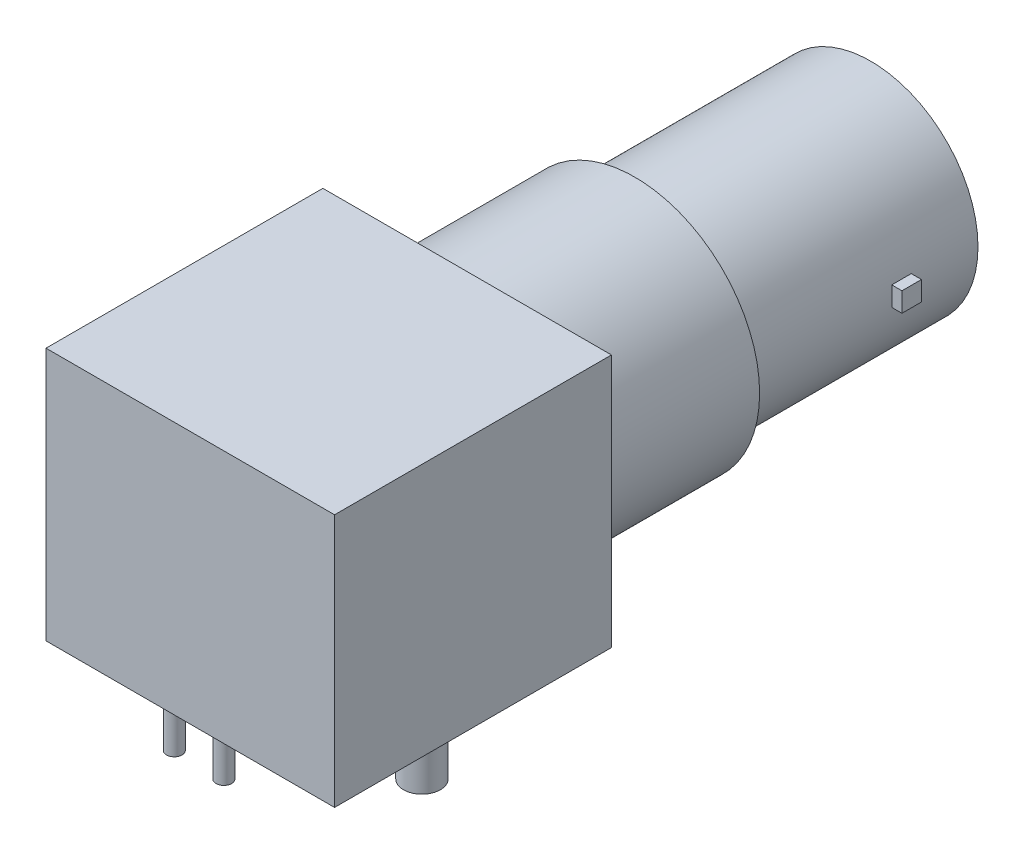
ISO-10303-21;
HEADER;
FILE_DESCRIPTION(('STEP AP214'),'2;1');
FILE_NAME('part.step','',(''),(''),'','','');
FILE_SCHEMA(('AUTOMOTIVE_DESIGN { 1 0 10303 214 1 1 1 1 }'));
ENDSEC;
DATA;
#1=APPLICATION_CONTEXT('core data for automotive mechanical design processes');
#2=APPLICATION_PROTOCOL_DEFINITION('international standard','automotive_design',2000,#1);
#3=PRODUCT_CONTEXT('',#1,'mechanical');
#4=PRODUCT('Part','Part','',(#3));
#5=PRODUCT_RELATED_PRODUCT_CATEGORY('part','',(#4));
#6=PRODUCT_DEFINITION_FORMATION('','',#4);
#7=PRODUCT_DEFINITION_CONTEXT('part definition',#1,'design');
#8=PRODUCT_DEFINITION('design','',#6,#7);
#9=PRODUCT_DEFINITION_SHAPE('','',#8);
#10=(LENGTH_UNIT() NAMED_UNIT(*) SI_UNIT(.MILLI.,.METRE.));
#11=(NAMED_UNIT(*) PLANE_ANGLE_UNIT() SI_UNIT($,.RADIAN.));
#12=(NAMED_UNIT(*) SI_UNIT($,.STERADIAN.) SOLID_ANGLE_UNIT());
#13=UNCERTAINTY_MEASURE_WITH_UNIT(LENGTH_MEASURE(1.E-05),#10,'distance_accuracy_value','');
#14=(GEOMETRIC_REPRESENTATION_CONTEXT(3) GLOBAL_UNCERTAINTY_ASSIGNED_CONTEXT((#13)) GLOBAL_UNIT_ASSIGNED_CONTEXT((#10,
#11,#12)) REPRESENTATION_CONTEXT('',''));
#15=CARTESIAN_POINT('',(0.,0.,0.));
#16=DIRECTION('',(0.,0.,1.));
#17=DIRECTION('',(1.,0.,0.));
#18=AXIS2_PLACEMENT_3D('',#15,#16,#17);
#19=CARTESIAN_POINT('',(-7.40000000000001,-6.5,-14.2));
#20=DIRECTION('',(0.,-1.,0.));
#21=DIRECTION('',(0.,0.,-1.));
#22=AXIS2_PLACEMENT_3D('',#19,#20,#21);
#23=PLANE('',#22);
#24=CARTESIAN_POINT('',(0.,-6.5,-1.72));
#25=DIRECTION('',(0.,-1.,0.));
#26=DIRECTION('',(0.,0.,-1.));
#27=AXIS2_PLACEMENT_3D('',#24,#25,#26);
#28=CIRCLE('',#27,0.4);
#29=CARTESIAN_POINT('',(0.,-6.5,-2.12));
#30=VERTEX_POINT('',#29);
#31=EDGE_CURVE('E384',#30,#30,#28,.T.);
#32=ORIENTED_EDGE('',*,*,#31,.F.);
#33=EDGE_LOOP('',(#32));
#34=FACE_BOUND('',#33,.T.);
#35=CARTESIAN_POINT('',(5.08,-6.5,-6.8));
#36=DIRECTION('',(0.,-1.,0.));
#37=DIRECTION('',(0.,0.,-1.));
#38=AXIS2_PLACEMENT_3D('',#35,#36,#37);
#39=CIRCLE('',#38,0.949999999999999);
#40=CARTESIAN_POINT('',(5.08,-6.5,-7.75));
#41=VERTEX_POINT('',#40);
#42=EDGE_CURVE('E179',#41,#41,#39,.T.);
#43=ORIENTED_EDGE('',*,*,#42,.F.);
#44=EDGE_LOOP('',(#43));
#45=FACE_BOUND('',#44,.T.);
#46=DIRECTION('',(1.,0.,0.));
#47=VECTOR('',#46,1.);
#48=CARTESIAN_POINT('',(-7.40000000000001,-6.5,0.));
#49=LINE('',#48,#47);
#50=CARTESIAN_POINT('',(-7.40000000000001,-6.5,0.));
#51=VERTEX_POINT('',#50);
#52=CARTESIAN_POINT('',(7.4,-6.5,0.));
#53=VERTEX_POINT('',#52);
#54=EDGE_CURVE('E243',#51,#53,#49,.T.);
#55=ORIENTED_EDGE('',*,*,#54,.F.);
#56=DIRECTION('',(0.,0.,1.));
#57=VECTOR('',#56,1.);
#58=CARTESIAN_POINT('',(-7.40000000000001,-6.5,-14.2));
#59=LINE('',#58,#57);
#60=CARTESIAN_POINT('',(-7.40000000000001,-6.5,-14.2));
#61=VERTEX_POINT('',#60);
#62=EDGE_CURVE('E266',#61,#51,#59,.T.);
#63=ORIENTED_EDGE('',*,*,#62,.F.);
#64=DIRECTION('',(1.,0.,0.));
#65=VECTOR('',#64,1.);
#66=CARTESIAN_POINT('',(-7.40000000000001,-6.5,-14.2));
#67=LINE('',#66,#65);
#68=CARTESIAN_POINT('',(7.4,-6.5,-14.2));
#69=VERTEX_POINT('',#68);
#70=EDGE_CURVE('E249',#61,#69,#67,.T.);
#71=ORIENTED_EDGE('',*,*,#70,.T.);
#72=DIRECTION('',(0.,0.,1.));
#73=VECTOR('',#72,1.);
#74=CARTESIAN_POINT('',(7.4,-6.5,-14.2));
#75=LINE('',#74,#73);
#76=EDGE_CURVE('E263',#69,#53,#75,.T.);
#77=ORIENTED_EDGE('',*,*,#76,.T.);
#78=EDGE_LOOP('',(#55,#63,#71,#77));
#79=FACE_BOUND('',#78,.T.);
#80=CARTESIAN_POINT('',(-5.08,-6.5,-6.8));
#81=DIRECTION('',(0.,-1.,0.));
#82=DIRECTION('',(0.,0.,-1.));
#83=AXIS2_PLACEMENT_3D('',#80,#81,#82);
#84=CIRCLE('',#83,0.95);
#85=CARTESIAN_POINT('',(-5.08,-6.5,-7.75));
#86=VERTEX_POINT('',#85);
#87=EDGE_CURVE('E376',#86,#86,#84,.T.);
#88=ORIENTED_EDGE('',*,*,#87,.F.);
#89=EDGE_LOOP('',(#88));
#90=FACE_BOUND('',#89,.T.);
#91=CARTESIAN_POINT('',(-2.54,-6.5,-1.72));
#92=DIRECTION('',(0.,-1.,0.));
#93=DIRECTION('',(0.,0.,-1.));
#94=AXIS2_PLACEMENT_3D('',#91,#92,#93);
#95=CIRCLE('',#94,0.4);
#96=CARTESIAN_POINT('',(-2.54,-6.5,-2.12));
#97=VERTEX_POINT('',#96);
#98=EDGE_CURVE('E379',#97,#97,#95,.T.);
#99=ORIENTED_EDGE('',*,*,#98,.F.);
#100=EDGE_LOOP('',(#99));
#101=FACE_BOUND('',#100,.T.);
#102=ADVANCED_FACE('F37',(#34,#45,#79,#90,#101),#23,.T.);
#103=CARTESIAN_POINT('',(0.,0.,-22.8));
#104=DIRECTION('',(0.,0.,-1.));
#105=DIRECTION('',(-1.,0.,0.));
#106=AXIS2_PLACEMENT_3D('',#103,#104,#105);
#107=PLANE('',#106);
#108=CARTESIAN_POINT('',(0.,0.,-22.8));
#109=DIRECTION('',(0.,0.,-1.));
#110=DIRECTION('',(-1.,0.,0.));
#111=AXIS2_PLACEMENT_3D('',#108,#109,#110);
#112=CIRCLE('',#111,6.4);
#113=CARTESIAN_POINT('',(6.4,0.,-22.8));
#114=VERTEX_POINT('',#113);
#115=EDGE_CURVE('E233',#114,#114,#112,.T.);
#116=ORIENTED_EDGE('',*,*,#115,.T.);
#117=EDGE_LOOP('',(#116));
#118=FACE_BOUND('',#117,.T.);
#119=CARTESIAN_POINT('',(0.,0.,-22.8));
#120=DIRECTION('',(0.,0.,-1.));
#121=DIRECTION('',(-1.,0.,0.));
#122=AXIS2_PLACEMENT_3D('',#119,#120,#121);
#123=CIRCLE('',#122,5.5);
#124=CARTESIAN_POINT('',(-5.5,0.,-22.8));
#125=VERTEX_POINT('',#124);
#126=EDGE_CURVE('E229',#125,#125,#123,.T.);
#127=ORIENTED_EDGE('',*,*,#126,.F.);
#128=EDGE_LOOP('',(#127));
#129=FACE_BOUND('',#128,.T.);
#130=ADVANCED_FACE('F327',(#118,#129),#107,.T.);
#131=CARTESIAN_POINT('',(0.,0.,-14.2));
#132=DIRECTION('',(0.,0.,1.));
#133=DIRECTION('',(1.,0.,0.));
#134=AXIS2_PLACEMENT_3D('',#131,#132,#133);
#135=PLANE('',#134);
#136=DIRECTION('',(0.,1.,0.));
#137=VECTOR('',#136,1.);
#138=CARTESIAN_POINT('',(7.39999999999999,6.5,-14.2));
#139=LINE('',#138,#137);
#140=CARTESIAN_POINT('',(7.39999999999999,6.5,-14.2));
#141=VERTEX_POINT('',#140);
#142=EDGE_CURVE('E239',#69,#141,#139,.T.);
#143=ORIENTED_EDGE('',*,*,#142,.F.);
#144=ORIENTED_EDGE('',*,*,#70,.F.);
#145=DIRECTION('',(0.,-1.,0.));
#146=VECTOR('',#145,1.);
#147=CARTESIAN_POINT('',(-7.40000000000001,6.5,-14.2));
#148=LINE('',#147,#146);
#149=CARTESIAN_POINT('',(-7.40000000000001,6.5,-14.2));
#150=VERTEX_POINT('',#149);
#151=EDGE_CURVE('E246',#150,#61,#148,.T.);
#152=ORIENTED_EDGE('',*,*,#151,.F.);
#153=DIRECTION('',(-1.,0.,0.));
#154=VECTOR('',#153,1.);
#155=CARTESIAN_POINT('',(-7.40000000000001,6.5,-14.2));
#156=LINE('',#155,#154);
#157=EDGE_CURVE('E242',#141,#150,#156,.T.);
#158=ORIENTED_EDGE('',*,*,#157,.F.);
#159=EDGE_LOOP('',(#143,#144,#152,#158));
#160=FACE_BOUND('',#159,.T.);
#161=CARTESIAN_POINT('',(0.,0.,-14.2));
#162=DIRECTION('',(0.,0.,1.));
#163=DIRECTION('',(1.,0.,0.));
#164=AXIS2_PLACEMENT_3D('',#161,#162,#163);
#165=CIRCLE('',#164,6.4);
#166=CARTESIAN_POINT('',(6.4,0.,-14.2));
#167=VERTEX_POINT('',#166);
#168=EDGE_CURVE('E265',#167,#167,#165,.F.);
#169=ORIENTED_EDGE('',*,*,#168,.F.);
#170=EDGE_LOOP('',(#169));
#171=FACE_BOUND('',#170,.T.);
#172=ADVANCED_FACE('F336',(#160,#171),#135,.F.);
#173=CARTESIAN_POINT('',(7.39999999999999,6.5,-14.2));
#174=DIRECTION('',(1.,0.,0.));
#175=DIRECTION('',(0.,1.,0.));
#176=AXIS2_PLACEMENT_3D('',#173,#174,#175);
#177=PLANE('',#176);
#178=DIRECTION('',(0.,1.,0.));
#179=VECTOR('',#178,1.);
#180=CARTESIAN_POINT('',(7.39999999999999,6.5,0.));
#181=LINE('',#180,#179);
#182=CARTESIAN_POINT('',(7.39999999999999,6.5,0.));
#183=VERTEX_POINT('',#182);
#184=EDGE_CURVE('E238',#53,#183,#181,.T.);
#185=ORIENTED_EDGE('',*,*,#184,.F.);
#186=ORIENTED_EDGE('',*,*,#76,.F.);
#187=ORIENTED_EDGE('',*,*,#142,.T.);
#188=DIRECTION('',(0.,0.,1.));
#189=VECTOR('',#188,1.);
#190=CARTESIAN_POINT('',(7.39999999999999,6.5,-14.2));
#191=LINE('',#190,#189);
#192=EDGE_CURVE('E252',#141,#183,#191,.T.);
#193=ORIENTED_EDGE('',*,*,#192,.T.);
#194=EDGE_LOOP('',(#185,#186,#187,#193));
#195=FACE_BOUND('',#194,.T.);
#196=ADVANCED_FACE('F39',(#195),#177,.T.);
#197=CARTESIAN_POINT('',(-7.40000000000001,6.5,-14.2));
#198=DIRECTION('',(-1.,0.,0.));
#199=DIRECTION('',(0.,-1.,0.));
#200=AXIS2_PLACEMENT_3D('',#197,#198,#199);
#201=PLANE('',#200);
#202=DIRECTION('',(0.,-1.,0.));
#203=VECTOR('',#202,1.);
#204=CARTESIAN_POINT('',(-7.40000000000001,6.5,0.));
#205=LINE('',#204,#203);
#206=CARTESIAN_POINT('',(-7.40000000000001,6.5,0.));
#207=VERTEX_POINT('',#206);
#208=EDGE_CURVE('E258',#207,#51,#205,.T.);
#209=ORIENTED_EDGE('',*,*,#208,.F.);
#210=DIRECTION('',(0.,0.,1.));
#211=VECTOR('',#210,1.);
#212=CARTESIAN_POINT('',(-7.40000000000001,6.5,-14.2));
#213=LINE('',#212,#211);
#214=EDGE_CURVE('E268',#150,#207,#213,.T.);
#215=ORIENTED_EDGE('',*,*,#214,.F.);
#216=ORIENTED_EDGE('',*,*,#151,.T.);
#217=ORIENTED_EDGE('',*,*,#62,.T.);
#218=EDGE_LOOP('',(#209,#215,#216,#217));
#219=FACE_BOUND('',#218,.T.);
#220=ADVANCED_FACE('F349',(#219),#201,.T.);
#221=CARTESIAN_POINT('',(-7.40000000000001,6.5,-14.2));
#222=DIRECTION('',(0.,1.,0.));
#223=DIRECTION('',(0.,0.,1.));
#224=AXIS2_PLACEMENT_3D('',#221,#222,#223);
#225=PLANE('',#224);
#226=DIRECTION('',(-1.,0.,0.));
#227=VECTOR('',#226,1.);
#228=CARTESIAN_POINT('',(-7.40000000000001,6.5,0.));
#229=LINE('',#228,#227);
#230=EDGE_CURVE('E255',#183,#207,#229,.T.);
#231=ORIENTED_EDGE('',*,*,#230,.F.);
#232=ORIENTED_EDGE('',*,*,#192,.F.);
#233=ORIENTED_EDGE('',*,*,#157,.T.);
#234=ORIENTED_EDGE('',*,*,#214,.T.);
#235=EDGE_LOOP('',(#231,#232,#233,#234));
#236=FACE_BOUND('',#235,.T.);
#237=ADVANCED_FACE('F351',(#236),#225,.T.);
#238=CARTESIAN_POINT('',(0.,0.,0.));
#239=DIRECTION('',(0.,0.,1.));
#240=DIRECTION('',(1.,0.,0.));
#241=AXIS2_PLACEMENT_3D('',#238,#239,#240);
#242=PLANE('',#241);
#243=ORIENTED_EDGE('',*,*,#184,.T.);
#244=ORIENTED_EDGE('',*,*,#230,.T.);
#245=ORIENTED_EDGE('',*,*,#208,.T.);
#246=ORIENTED_EDGE('',*,*,#54,.T.);
#247=EDGE_LOOP('',(#243,#244,#245,#246));
#248=FACE_BOUND('',#247,.T.);
#249=ADVANCED_FACE('F347',(#248),#242,.T.);
#250=CARTESIAN_POINT('',(0.,0.,-22.8));
#251=DIRECTION('',(0.,0.,1.));
#252=DIRECTION('',(1.,0.,0.));
#253=AXIS2_PLACEMENT_3D('',#250,#251,#252);
#254=CYLINDRICAL_SURFACE('',#253,6.4);
#255=CARTESIAN_POINT('',(6.4,0.,-22.8));
#256=CARTESIAN_POINT('',(6.4,0.,-22.7104166666667));
#257=CARTESIAN_POINT('',(6.4,0.,-22.6208333333333));
#258=CARTESIAN_POINT('',(6.4,0.,-22.4416666666667));
#259=CARTESIAN_POINT('',(6.4,0.,-22.3520833333333));
#260=CARTESIAN_POINT('',(6.4,0.,-22.1729166666667));
#261=CARTESIAN_POINT('',(6.4,0.,-22.0833333333333));
#262=CARTESIAN_POINT('',(6.4,0.,-21.9041666666667));
#263=CARTESIAN_POINT('',(6.4,0.,-21.8145833333333));
#264=CARTESIAN_POINT('',(6.4,0.,-21.6354166666667));
#265=CARTESIAN_POINT('',(6.4,0.,-21.5458333333333));
#266=CARTESIAN_POINT('',(6.4,0.,-21.3666666666667));
#267=CARTESIAN_POINT('',(6.4,0.,-21.2770833333333));
#268=CARTESIAN_POINT('',(6.4,0.,-21.0979166666667));
#269=CARTESIAN_POINT('',(6.4,0.,-21.0083333333333));
#270=CARTESIAN_POINT('',(6.4,0.,-20.8291666666667));
#271=CARTESIAN_POINT('',(6.4,0.,-20.7395833333333));
#272=CARTESIAN_POINT('',(6.4,0.,-20.5604166666667));
#273=CARTESIAN_POINT('',(6.4,0.,-20.4708333333333));
#274=CARTESIAN_POINT('',(6.4,0.,-20.2916666666667));
#275=CARTESIAN_POINT('',(6.4,0.,-20.2020833333333));
#276=CARTESIAN_POINT('',(6.4,0.,-20.0229166666667));
#277=CARTESIAN_POINT('',(6.4,0.,-19.9333333333333));
#278=CARTESIAN_POINT('',(6.4,0.,-19.7541666666667));
#279=CARTESIAN_POINT('',(6.4,0.,-19.6645833333333));
#280=CARTESIAN_POINT('',(6.4,0.,-19.4854166666667));
#281=CARTESIAN_POINT('',(6.4,0.,-19.3958333333333));
#282=CARTESIAN_POINT('',(6.4,0.,-19.2166666666667));
#283=CARTESIAN_POINT('',(6.4,0.,-19.1270833333333));
#284=CARTESIAN_POINT('',(6.4,0.,-18.9479166666667));
#285=CARTESIAN_POINT('',(6.4,0.,-18.8583333333333));
#286=CARTESIAN_POINT('',(6.4,0.,-18.6791666666667));
#287=CARTESIAN_POINT('',(6.4,0.,-18.5895833333333));
#288=CARTESIAN_POINT('',(6.4,0.,-18.4104166666667));
#289=CARTESIAN_POINT('',(6.4,0.,-18.3208333333333));
#290=CARTESIAN_POINT('',(6.4,0.,-18.1416666666667));
#291=CARTESIAN_POINT('',(6.4,0.,-18.0520833333333));
#292=CARTESIAN_POINT('',(6.4,0.,-17.8729166666667));
#293=CARTESIAN_POINT('',(6.4,0.,-17.7833333333333));
#294=CARTESIAN_POINT('',(6.4,0.,-17.6041666666667));
#295=CARTESIAN_POINT('',(6.4,0.,-17.5145833333333));
#296=CARTESIAN_POINT('',(6.4,0.,-17.3354166666667));
#297=CARTESIAN_POINT('',(6.4,0.,-17.2458333333333));
#298=CARTESIAN_POINT('',(6.4,0.,-17.0666666666667));
#299=CARTESIAN_POINT('',(6.4,0.,-16.9770833333333));
#300=CARTESIAN_POINT('',(6.4,0.,-16.7979166666667));
#301=CARTESIAN_POINT('',(6.4,0.,-16.7083333333333));
#302=CARTESIAN_POINT('',(6.4,0.,-16.5291666666667));
#303=CARTESIAN_POINT('',(6.4,0.,-16.4395833333333));
#304=CARTESIAN_POINT('',(6.4,0.,-16.2604166666667));
#305=CARTESIAN_POINT('',(6.4,0.,-16.1708333333333));
#306=CARTESIAN_POINT('',(6.4,0.,-15.9916666666667));
#307=CARTESIAN_POINT('',(6.4,0.,-15.9020833333333));
#308=CARTESIAN_POINT('',(6.4,0.,-15.7229166666667));
#309=CARTESIAN_POINT('',(6.4,0.,-15.6333333333333));
#310=CARTESIAN_POINT('',(6.4,0.,-15.4541666666667));
#311=CARTESIAN_POINT('',(6.4,0.,-15.3645833333333));
#312=CARTESIAN_POINT('',(6.4,0.,-15.1854166666667));
#313=CARTESIAN_POINT('',(6.4,0.,-15.0958333333333));
#314=CARTESIAN_POINT('',(6.4,0.,-14.9166666666667));
#315=CARTESIAN_POINT('',(6.4,0.,-14.8270833333333));
#316=CARTESIAN_POINT('',(6.4,0.,-14.6479166666667));
#317=CARTESIAN_POINT('',(6.4,0.,-14.5583333333333));
#318=CARTESIAN_POINT('',(6.4,0.,-14.3791666666667));
#319=CARTESIAN_POINT('',(6.4,0.,-14.2895833333333));
#320=CARTESIAN_POINT('',(6.4,0.,-14.2));
#321=B_SPLINE_CURVE_WITH_KNOTS('',3,(#255,#256,#257,#258,#259,#260,#261,#262,#263,#264,#265,
#266,#267,#268,#269,#270,#271,#272,#273,#274,#275,#276,#277,#278,#279,#280,#281,#282,#283,#284,
#285,#286,#287,#288,#289,#290,#291,#292,#293,#294,#295,#296,#297,#298,#299,#300,#301,#302,#303,
#304,#305,#306,#307,#308,#309,#310,#311,#312,#313,#314,#315,#316,#317,#318,#319,#320),
.UNSPECIFIED.,.F.,.F.,(4,2,2,2,2,2,2,2,2,2,2,2,2,2,2,2,2,2,2,2,2,2,2,2,2,2,2,2,2,2,2,2,4),(0.,
0.268749999999998,0.5375,0.806249999999998,1.075,1.34375,1.6125,1.88125,2.15,2.41875,2.6875,
2.95625,3.225,3.49375,3.7625,4.03125,4.3,4.56875,4.8375,5.10625,5.375,5.64375,5.9125,6.18125,
6.45,6.71875,6.9875,7.25625,7.525,7.79375,8.0625,8.33125,8.6),.UNSPECIFIED.);
#322=EDGE_CURVE('BSEAM358',#114,#167,#321,.T.);
#323=ORIENTED_EDGE('',*,*,#115,.F.);
#324=ORIENTED_EDGE('',*,*,#168,.T.);
#325=ORIENTED_EDGE('',*,*,#322,.T.);
#326=ORIENTED_EDGE('',*,*,#322,.F.);
#327=EDGE_LOOP('',(#323,#325,#324,#326));
#328=FACE_BOUND('',#327,.T.);
#329=ADVANCED_FACE('F358',(#328),#254,.T.);
#330=CARTESIAN_POINT('',(0.,0.,-34.9));
#331=DIRECTION('',(0.,0.,-1.));
#332=DIRECTION('',(-1.,0.,0.));
#333=AXIS2_PLACEMENT_3D('',#330,#331,#332);
#334=PLANE('',#333);
#335=CARTESIAN_POINT('',(0.,0.,-34.9));
#336=DIRECTION('',(0.,0.,-1.));
#337=DIRECTION('',(-1.,0.,0.));
#338=AXIS2_PLACEMENT_3D('',#335,#336,#337);
#339=CIRCLE('',#338,5.5);
#340=CARTESIAN_POINT('',(-5.5,0.,-34.9));
#341=VERTEX_POINT('',#340);
#342=EDGE_CURVE('E230',#341,#341,#339,.T.);
#343=ORIENTED_EDGE('',*,*,#342,.T.);
#344=EDGE_LOOP('',(#343));
#345=FACE_BOUND('',#344,.T.);
#346=CARTESIAN_POINT('',(0.,0.,-34.9));
#347=DIRECTION('',(0.,0.,-1.));
#348=DIRECTION('',(-1.,0.,0.));
#349=AXIS2_PLACEMENT_3D('',#346,#347,#348);
#350=CIRCLE('',#349,5.);
#351=CARTESIAN_POINT('',(-5.,0.,-34.9));
#352=VERTEX_POINT('',#351);
#353=EDGE_CURVE('E226',#352,#352,#350,.T.);
#354=ORIENTED_EDGE('',*,*,#353,.F.);
#355=EDGE_LOOP('',(#354));
#356=FACE_BOUND('',#355,.T.);
#357=ADVANCED_FACE('F433',(#345,#356),#334,.T.);
#358=CARTESIAN_POINT('',(0.,0.,-34.9));
#359=DIRECTION('',(0.,0.,1.));
#360=DIRECTION('',(1.,0.,0.));
#361=AXIS2_PLACEMENT_3D('',#358,#359,#360);
#362=CYLINDRICAL_SURFACE('',#361,5.5);
#363=DIRECTION('',(0.,0.,1.));
#364=VECTOR('',#363,1.);
#365=CARTESIAN_POINT('',(-5.47722557505166,-0.5,-34.9));
#366=LINE('',#365,#364);
#367=CARTESIAN_POINT('',(-5.47722557505166,-0.5,-30.5));
#368=VERTEX_POINT('',#367);
#369=CARTESIAN_POINT('',(-5.47722557505166,-0.5,-31.5));
#370=VERTEX_POINT('',#369);
#371=EDGE_CURVE('E217',#368,#370,#366,.F.);
#372=ORIENTED_EDGE('',*,*,#371,.T.);
#373=CARTESIAN_POINT('',(0.,0.,-31.5));
#374=DIRECTION('',(0.,0.,-1.));
#375=DIRECTION('',(-1.,0.,0.));
#376=AXIS2_PLACEMENT_3D('',#373,#374,#375);
#377=CIRCLE('',#376,5.5);
#378=CARTESIAN_POINT('',(-5.47722557505166,0.5,-31.5));
#379=VERTEX_POINT('',#378);
#380=EDGE_CURVE('E223',#370,#379,#377,.T.);
#381=ORIENTED_EDGE('',*,*,#380,.T.);
#382=DIRECTION('',(0.,0.,1.));
#383=VECTOR('',#382,1.);
#384=CARTESIAN_POINT('',(-5.47722557505166,0.5,-34.9));
#385=LINE('',#384,#383);
#386=CARTESIAN_POINT('',(-5.47722557505166,0.5,-30.5));
#387=VERTEX_POINT('',#386);
#388=EDGE_CURVE('E210',#379,#387,#385,.T.);
#389=ORIENTED_EDGE('',*,*,#388,.T.);
#390=CARTESIAN_POINT('',(0.,0.,-30.5));
#391=DIRECTION('',(0.,0.,1.));
#392=DIRECTION('',(1.,0.,0.));
#393=AXIS2_PLACEMENT_3D('',#390,#391,#392);
#394=CIRCLE('',#393,5.5);
#395=EDGE_CURVE('E216',#387,#368,#394,.T.);
#396=ORIENTED_EDGE('',*,*,#395,.T.);
#397=EDGE_LOOP('',(#372,#381,#389,#396));
#398=FACE_BOUND('',#397,.T.);
#399=DIRECTION('',(0.,0.,1.));
#400=VECTOR('',#399,1.);
#401=CARTESIAN_POINT('',(5.47722557505166,0.5,-34.9));
#402=LINE('',#401,#400);
#403=CARTESIAN_POINT('',(5.47722557505166,0.5,-30.5));
#404=VERTEX_POINT('',#403);
#405=CARTESIAN_POINT('',(5.47722557505166,0.5,-31.5));
#406=VERTEX_POINT('',#405);
#407=EDGE_CURVE('E198',#404,#406,#402,.F.);
#408=ORIENTED_EDGE('',*,*,#407,.T.);
#409=CARTESIAN_POINT('',(5.47722557505166,-0.5,-31.5));
#410=VERTEX_POINT('',#409);
#411=EDGE_CURVE('E156',#406,#410,#377,.T.);
#412=ORIENTED_EDGE('',*,*,#411,.T.);
#413=DIRECTION('',(0.,0.,1.));
#414=VECTOR('',#413,1.);
#415=CARTESIAN_POINT('',(5.47722557505166,-0.5,-34.9));
#416=LINE('',#415,#414);
#417=CARTESIAN_POINT('',(5.47722557505166,-0.5,-30.5));
#418=VERTEX_POINT('',#417);
#419=EDGE_CURVE('E220',#410,#418,#416,.T.);
#420=ORIENTED_EDGE('',*,*,#419,.T.);
#421=EDGE_CURVE('E213',#418,#404,#394,.T.);
#422=ORIENTED_EDGE('',*,*,#421,.T.);
#423=EDGE_LOOP('',(#408,#412,#420,#422));
#424=FACE_BOUND('',#423,.T.);
#425=ORIENTED_EDGE('',*,*,#342,.F.);
#426=EDGE_LOOP('',(#425));
#427=FACE_BOUND('',#426,.T.);
#428=ORIENTED_EDGE('',*,*,#126,.T.);
#429=EDGE_LOOP('',(#428));
#430=FACE_BOUND('',#429,.T.);
#431=ADVANCED_FACE('F309',(#398,#424,#427,#430),#362,.T.);
#432=CARTESIAN_POINT('',(0.,0.,-34.9));
#433=DIRECTION('',(0.,0.,1.));
#434=DIRECTION('',(1.,0.,0.));
#435=AXIS2_PLACEMENT_3D('',#432,#433,#434);
#436=CYLINDRICAL_SURFACE('',#435,5.);
#437=CARTESIAN_POINT('',(0.,0.,-31.5));
#438=DIRECTION('',(0.,0.,-1.));
#439=DIRECTION('',(-1.,0.,0.));
#440=AXIS2_PLACEMENT_3D('',#437,#438,#439);
#441=CIRCLE('',#440,5.);
#442=CARTESIAN_POINT('',(-4.9749371855331,-0.5,-31.5));
#443=VERTEX_POINT('',#442);
#444=CARTESIAN_POINT('',(-4.9749371855331,0.5,-31.5));
#445=VERTEX_POINT('',#444);
#446=EDGE_CURVE('E11',#443,#445,#441,.T.);
#447=ORIENTED_EDGE('',*,*,#446,.F.);
#448=DIRECTION('',(0.,0.,1.));
#449=VECTOR('',#448,1.);
#450=CARTESIAN_POINT('',(-4.9749371855331,-0.5,-34.9));
#451=LINE('',#450,#449);
#452=CARTESIAN_POINT('',(-4.9749371855331,-0.5,-30.5));
#453=VERTEX_POINT('',#452);
#454=EDGE_CURVE('E41',#453,#443,#451,.F.);
#455=ORIENTED_EDGE('',*,*,#454,.F.);
#456=CARTESIAN_POINT('',(0.,0.,-30.5));
#457=DIRECTION('',(0.,0.,1.));
#458=DIRECTION('',(1.,0.,0.));
#459=AXIS2_PLACEMENT_3D('',#456,#457,#458);
#460=CIRCLE('',#459,5.);
#461=CARTESIAN_POINT('',(-4.9749371855331,0.5,-30.5));
#462=VERTEX_POINT('',#461);
#463=EDGE_CURVE('E283',#462,#453,#460,.T.);
#464=ORIENTED_EDGE('',*,*,#463,.F.);
#465=DIRECTION('',(0.,0.,1.));
#466=VECTOR('',#465,1.);
#467=CARTESIAN_POINT('',(-4.9749371855331,0.5,-34.9));
#468=LINE('',#467,#466);
#469=EDGE_CURVE('E286',#445,#462,#468,.T.);
#470=ORIENTED_EDGE('',*,*,#469,.F.);
#471=EDGE_LOOP('',(#447,#455,#464,#470));
#472=FACE_BOUND('',#471,.T.);
#473=CARTESIAN_POINT('',(4.9749371855331,0.5,-31.5));
#474=VERTEX_POINT('',#473);
#475=CARTESIAN_POINT('',(4.9749371855331,-0.5,-31.5));
#476=VERTEX_POINT('',#475);
#477=EDGE_CURVE('E47',#474,#476,#441,.T.);
#478=ORIENTED_EDGE('',*,*,#477,.F.);
#479=DIRECTION('',(0.,0.,1.));
#480=VECTOR('',#479,1.);
#481=CARTESIAN_POINT('',(4.9749371855331,0.5,-34.9));
#482=LINE('',#481,#480);
#483=CARTESIAN_POINT('',(4.9749371855331,0.5,-30.5));
#484=VERTEX_POINT('',#483);
#485=EDGE_CURVE('E276',#484,#474,#482,.F.);
#486=ORIENTED_EDGE('',*,*,#485,.F.);
#487=CARTESIAN_POINT('',(4.9749371855331,-0.5,-30.5));
#488=VERTEX_POINT('',#487);
#489=EDGE_CURVE('E279',#488,#484,#460,.T.);
#490=ORIENTED_EDGE('',*,*,#489,.F.);
#491=DIRECTION('',(0.,0.,1.));
#492=VECTOR('',#491,1.);
#493=CARTESIAN_POINT('',(4.9749371855331,-0.5,-34.9));
#494=LINE('',#493,#492);
#495=EDGE_CURVE('E282',#476,#488,#494,.T.);
#496=ORIENTED_EDGE('',*,*,#495,.F.);
#497=EDGE_LOOP('',(#478,#486,#490,#496));
#498=FACE_BOUND('',#497,.T.);
#499=ORIENTED_EDGE('',*,*,#353,.T.);
#500=EDGE_LOOP('',(#499));
#501=FACE_BOUND('',#500,.T.);
#502=CARTESIAN_POINT('',(0.,0.,-22.8));
#503=DIRECTION('',(0.,0.,-1.));
#504=DIRECTION('',(-1.,0.,0.));
#505=AXIS2_PLACEMENT_3D('',#502,#503,#504);
#506=CIRCLE('',#505,5.);
#507=CARTESIAN_POINT('',(-5.,0.,-22.8));
#508=VERTEX_POINT('',#507);
#509=EDGE_CURVE('E273',#508,#508,#506,.F.);
#510=ORIENTED_EDGE('',*,*,#509,.T.);
#511=EDGE_LOOP('',(#510));
#512=FACE_BOUND('',#511,.T.);
#513=ADVANCED_FACE('F316',(#472,#498,#501,#512),#436,.F.);
#514=ORIENTED_EDGE('',*,*,#509,.F.);
#515=EDGE_LOOP('',(#514));
#516=FACE_BOUND('',#515,.T.);
#517=ADVANCED_FACE('F319',(#516),#107,.T.);
#518=CARTESIAN_POINT('',(-6.,0.5,-30.5));
#519=DIRECTION('',(0.,1.,0.));
#520=DIRECTION('',(0.,0.,1.));
#521=AXIS2_PLACEMENT_3D('',#518,#519,#520);
#522=PLANE('',#521);
#523=DIRECTION('',(1.,0.,0.));
#524=VECTOR('',#523,1.);
#525=CARTESIAN_POINT('',(-6.,0.5,-31.5));
#526=LINE('',#525,#524);
#527=EDGE_CURVE('E158',#445,#474,#526,.T.);
#528=ORIENTED_EDGE('',*,*,#527,.F.);
#529=ORIENTED_EDGE('',*,*,#469,.T.);
#530=DIRECTION('',(1.,0.,0.));
#531=VECTOR('',#530,1.);
#532=CARTESIAN_POINT('',(-6.,0.5,-30.5));
#533=LINE('',#532,#531);
#534=EDGE_CURVE('E206',#462,#484,#533,.T.);
#535=ORIENTED_EDGE('',*,*,#534,.T.);
#536=ORIENTED_EDGE('',*,*,#485,.T.);
#537=EDGE_LOOP('',(#528,#529,#535,#536));
#538=FACE_BOUND('',#537,.T.);
#539=ADVANCED_FACE('F313',(#538),#522,.T.);
#540=CARTESIAN_POINT('',(-6.,0.5,-30.5));
#541=DIRECTION('',(0.,0.,1.));
#542=DIRECTION('',(1.,0.,0.));
#543=AXIS2_PLACEMENT_3D('',#540,#541,#542);
#544=PLANE('',#543);
#545=ORIENTED_EDGE('',*,*,#534,.F.);
#546=ORIENTED_EDGE('',*,*,#463,.T.);
#547=DIRECTION('',(1.,0.,0.));
#548=VECTOR('',#547,1.);
#549=CARTESIAN_POINT('',(-6.,-0.5,-30.5));
#550=LINE('',#549,#548);
#551=EDGE_CURVE('E204',#453,#488,#550,.T.);
#552=ORIENTED_EDGE('',*,*,#551,.T.);
#553=ORIENTED_EDGE('',*,*,#489,.T.);
#554=EDGE_LOOP('',(#545,#546,#552,#553));
#555=FACE_BOUND('',#554,.T.);
#556=ADVANCED_FACE('F314',(#555),#544,.T.);
#557=CARTESIAN_POINT('',(-6.,-0.5,-30.5));
#558=DIRECTION('',(0.,-1.,0.));
#559=DIRECTION('',(0.,0.,-1.));
#560=AXIS2_PLACEMENT_3D('',#557,#558,#559);
#561=PLANE('',#560);
#562=DIRECTION('',(1.,0.,0.));
#563=VECTOR('',#562,1.);
#564=CARTESIAN_POINT('',(-6.,-0.5,-31.5));
#565=LINE('',#564,#563);
#566=EDGE_CURVE('E199',#443,#476,#565,.T.);
#567=ORIENTED_EDGE('',*,*,#566,.T.);
#568=ORIENTED_EDGE('',*,*,#495,.T.);
#569=ORIENTED_EDGE('',*,*,#551,.F.);
#570=ORIENTED_EDGE('',*,*,#454,.T.);
#571=EDGE_LOOP('',(#567,#568,#569,#570));
#572=FACE_BOUND('',#571,.T.);
#573=ADVANCED_FACE('F300',(#572),#561,.T.);
#574=CARTESIAN_POINT('',(-6.,0.5,-31.5));
#575=DIRECTION('',(0.,0.,-1.));
#576=DIRECTION('',(-1.,0.,0.));
#577=AXIS2_PLACEMENT_3D('',#574,#575,#576);
#578=PLANE('',#577);
#579=ORIENTED_EDGE('',*,*,#527,.T.);
#580=ORIENTED_EDGE('',*,*,#477,.T.);
#581=ORIENTED_EDGE('',*,*,#566,.F.);
#582=ORIENTED_EDGE('',*,*,#446,.T.);
#583=EDGE_LOOP('',(#579,#580,#581,#582));
#584=FACE_BOUND('',#583,.T.);
#585=ADVANCED_FACE('F304',(#584),#578,.T.);
#586=CARTESIAN_POINT('',(6.,0.,0.));
#587=DIRECTION('',(1.,0.,0.));
#588=DIRECTION('',(0.,0.,-1.));
#589=AXIS2_PLACEMENT_3D('',#586,#587,#588);
#590=PLANE('',#589);
#591=DIRECTION('',(0.,1.,0.));
#592=VECTOR('',#591,1.);
#593=CARTESIAN_POINT('',(6.,0.5,-31.5));
#594=LINE('',#593,#592);
#595=CARTESIAN_POINT('',(6.,-0.5,-31.5));
#596=VERTEX_POINT('',#595);
#597=CARTESIAN_POINT('',(6.,0.5,-31.5));
#598=VERTEX_POINT('',#597);
#599=EDGE_CURVE('E154',#596,#598,#594,.T.);
#600=ORIENTED_EDGE('',*,*,#599,.T.);
#601=DIRECTION('',(0.,0.,1.));
#602=VECTOR('',#601,1.);
#603=CARTESIAN_POINT('',(6.,0.5,-30.5));
#604=LINE('',#603,#602);
#605=CARTESIAN_POINT('',(6.,0.5,-30.5));
#606=VERTEX_POINT('',#605);
#607=EDGE_CURVE('E163',#598,#606,#604,.T.);
#608=ORIENTED_EDGE('',*,*,#607,.T.);
#609=DIRECTION('',(0.,-1.,0.));
#610=VECTOR('',#609,1.);
#611=CARTESIAN_POINT('',(6.,0.5,-30.5));
#612=LINE('',#611,#610);
#613=CARTESIAN_POINT('',(6.,-0.5,-30.5));
#614=VERTEX_POINT('',#613);
#615=EDGE_CURVE('E170',#606,#614,#612,.T.);
#616=ORIENTED_EDGE('',*,*,#615,.T.);
#617=DIRECTION('',(0.,0.,-1.));
#618=VECTOR('',#617,1.);
#619=CARTESIAN_POINT('',(6.,-0.5,-30.5));
#620=LINE('',#619,#618);
#621=EDGE_CURVE('E175',#614,#596,#620,.T.);
#622=ORIENTED_EDGE('',*,*,#621,.T.);
#623=EDGE_LOOP('',(#600,#608,#616,#622));
#624=FACE_BOUND('',#623,.T.);
#625=ADVANCED_FACE('F173',(#624),#590,.T.);
#626=ORIENTED_EDGE('',*,*,#407,.F.);
#627=EDGE_CURVE('E166',#404,#606,#533,.T.);
#628=ORIENTED_EDGE('',*,*,#627,.T.);
#629=ORIENTED_EDGE('',*,*,#607,.F.);
#630=EDGE_CURVE('E62',#406,#598,#526,.T.);
#631=ORIENTED_EDGE('',*,*,#630,.F.);
#632=EDGE_LOOP('',(#626,#628,#629,#631));
#633=FACE_BOUND('',#632,.T.);
#634=ADVANCED_FACE('F164',(#633),#522,.T.);
#635=ORIENTED_EDGE('',*,*,#421,.F.);
#636=EDGE_CURVE('E205',#418,#614,#550,.T.);
#637=ORIENTED_EDGE('',*,*,#636,.T.);
#638=ORIENTED_EDGE('',*,*,#615,.F.);
#639=ORIENTED_EDGE('',*,*,#627,.F.);
#640=EDGE_LOOP('',(#635,#637,#638,#639));
#641=FACE_BOUND('',#640,.T.);
#642=ADVANCED_FACE('F312',(#641),#544,.T.);
#643=ORIENTED_EDGE('',*,*,#419,.F.);
#644=EDGE_CURVE('E200',#410,#596,#565,.T.);
#645=ORIENTED_EDGE('',*,*,#644,.T.);
#646=ORIENTED_EDGE('',*,*,#621,.F.);
#647=ORIENTED_EDGE('',*,*,#636,.F.);
#648=EDGE_LOOP('',(#643,#645,#646,#647));
#649=FACE_BOUND('',#648,.T.);
#650=ADVANCED_FACE('F306',(#649),#561,.T.);
#651=ORIENTED_EDGE('',*,*,#411,.F.);
#652=ORIENTED_EDGE('',*,*,#630,.T.);
#653=ORIENTED_EDGE('',*,*,#599,.F.);
#654=ORIENTED_EDGE('',*,*,#644,.F.);
#655=EDGE_LOOP('',(#651,#652,#653,#654));
#656=FACE_BOUND('',#655,.T.);
#657=ADVANCED_FACE('F151',(#656),#578,.T.);
#658=ORIENTED_EDGE('',*,*,#380,.F.);
#659=CARTESIAN_POINT('',(-6.,-0.5,-31.5));
#660=VERTEX_POINT('',#659);
#661=EDGE_CURVE('E195',#660,#370,#565,.T.);
#662=ORIENTED_EDGE('',*,*,#661,.F.);
#663=DIRECTION('',(0.,1.,0.));
#664=VECTOR('',#663,1.);
#665=CARTESIAN_POINT('',(-6.,0.5,-31.5));
#666=LINE('',#665,#664);
#667=CARTESIAN_POINT('',(-6.,0.5,-31.5));
#668=VERTEX_POINT('',#667);
#669=EDGE_CURVE('E185',#660,#668,#666,.T.);
#670=ORIENTED_EDGE('',*,*,#669,.T.);
#671=EDGE_CURVE('E161',#668,#379,#526,.T.);
#672=ORIENTED_EDGE('',*,*,#671,.T.);
#673=EDGE_LOOP('',(#658,#662,#670,#672));
#674=FACE_BOUND('',#673,.T.);
#675=ADVANCED_FACE('F431',(#674),#578,.T.);
#676=ORIENTED_EDGE('',*,*,#371,.F.);
#677=CARTESIAN_POINT('',(-6.,-0.5,-30.5));
#678=VERTEX_POINT('',#677);
#679=EDGE_CURVE('E201',#678,#368,#550,.T.);
#680=ORIENTED_EDGE('',*,*,#679,.F.);
#681=DIRECTION('',(0.,0.,-1.));
#682=VECTOR('',#681,1.);
#683=CARTESIAN_POINT('',(-6.,-0.5,-30.5));
#684=LINE('',#683,#682);
#685=EDGE_CURVE('E159',#678,#660,#684,.T.);
#686=ORIENTED_EDGE('',*,*,#685,.T.);
#687=ORIENTED_EDGE('',*,*,#661,.T.);
#688=EDGE_LOOP('',(#676,#680,#686,#687));
#689=FACE_BOUND('',#688,.T.);
#690=ADVANCED_FACE('F426',(#689),#561,.T.);
#691=ORIENTED_EDGE('',*,*,#395,.F.);
#692=CARTESIAN_POINT('',(-6.,0.5,-30.5));
#693=VERTEX_POINT('',#692);
#694=EDGE_CURVE('E54',#693,#387,#533,.T.);
#695=ORIENTED_EDGE('',*,*,#694,.F.);
#696=DIRECTION('',(0.,-1.,0.));
#697=VECTOR('',#696,1.);
#698=CARTESIAN_POINT('',(-6.,0.5,-30.5));
#699=LINE('',#698,#697);
#700=EDGE_CURVE('E190',#693,#678,#699,.T.);
#701=ORIENTED_EDGE('',*,*,#700,.T.);
#702=ORIENTED_EDGE('',*,*,#679,.T.);
#703=EDGE_LOOP('',(#691,#695,#701,#702));
#704=FACE_BOUND('',#703,.T.);
#705=ADVANCED_FACE('F428',(#704),#544,.T.);
#706=ORIENTED_EDGE('',*,*,#388,.F.);
#707=ORIENTED_EDGE('',*,*,#671,.F.);
#708=DIRECTION('',(0.,0.,1.));
#709=VECTOR('',#708,1.);
#710=CARTESIAN_POINT('',(-6.,0.5,-30.5));
#711=LINE('',#710,#709);
#712=EDGE_CURVE('E188',#668,#693,#711,.T.);
#713=ORIENTED_EDGE('',*,*,#712,.T.);
#714=ORIENTED_EDGE('',*,*,#694,.T.);
#715=EDGE_LOOP('',(#706,#707,#713,#714));
#716=FACE_BOUND('',#715,.T.);
#717=ADVANCED_FACE('F332',(#716),#522,.T.);
#718=CARTESIAN_POINT('',(-6.,0.,0.));
#719=DIRECTION('',(1.,0.,0.));
#720=DIRECTION('',(0.,0.,-1.));
#721=AXIS2_PLACEMENT_3D('',#718,#719,#720);
#722=PLANE('',#721);
#723=ORIENTED_EDGE('',*,*,#669,.F.);
#724=ORIENTED_EDGE('',*,*,#685,.F.);
#725=ORIENTED_EDGE('',*,*,#700,.F.);
#726=ORIENTED_EDGE('',*,*,#712,.F.);
#727=EDGE_LOOP('',(#723,#724,#725,#726));
#728=FACE_BOUND('',#727,.T.);
#729=ADVANCED_FACE('F417',(#728),#722,.F.);
#730=CARTESIAN_POINT('',(5.08,-9.8,-6.8));
#731=DIRECTION('',(0.,1.,0.));
#732=DIRECTION('',(0.,0.,1.));
#733=AXIS2_PLACEMENT_3D('',#730,#731,#732);
#734=CYLINDRICAL_SURFACE('',#733,0.949999999999999);
#735=CARTESIAN_POINT('',(5.08,-9.8,-6.8));
#736=DIRECTION('',(0.,-1.,0.));
#737=DIRECTION('',(0.,0.,-1.));
#738=AXIS2_PLACEMENT_3D('',#735,#736,#737);
#739=CIRCLE('',#738,0.949999999999999);
#740=CARTESIAN_POINT('',(5.08,-9.8,-7.75));
#741=VERTEX_POINT('',#740);
#742=EDGE_CURVE('E176',#741,#741,#739,.T.);
#743=ORIENTED_EDGE('',*,*,#742,.F.);
#744=EDGE_LOOP('',(#743));
#745=FACE_BOUND('',#744,.T.);
#746=ORIENTED_EDGE('',*,*,#42,.T.);
#747=EDGE_LOOP('',(#746));
#748=FACE_BOUND('',#747,.T.);
#749=ADVANCED_FACE('F409',(#745,#748),#734,.T.);
#750=CARTESIAN_POINT('',(5.08,-9.8,-6.8));
#751=DIRECTION('',(0.,-1.,0.));
#752=DIRECTION('',(0.,0.,-1.));
#753=AXIS2_PLACEMENT_3D('',#750,#751,#752);
#754=PLANE('',#753);
#755=ORIENTED_EDGE('',*,*,#742,.T.);
#756=EDGE_LOOP('',(#755));
#757=FACE_BOUND('',#756,.T.);
#758=ADVANCED_FACE('F399',(#757),#754,.T.);
#759=CARTESIAN_POINT('',(-5.08,-9.8,-6.8));
#760=DIRECTION('',(0.,1.,0.));
#761=DIRECTION('',(0.,0.,1.));
#762=AXIS2_PLACEMENT_3D('',#759,#760,#761);
#763=CYLINDRICAL_SURFACE('',#762,0.95);
#764=CARTESIAN_POINT('',(-5.08,-9.8,-6.8));
#765=DIRECTION('',(0.,-1.,0.));
#766=DIRECTION('',(0.,0.,-1.));
#767=AXIS2_PLACEMENT_3D('',#764,#765,#766);
#768=CIRCLE('',#767,0.95);
#769=CARTESIAN_POINT('',(-5.08,-9.8,-7.75));
#770=VERTEX_POINT('',#769);
#771=EDGE_CURVE('E392',#770,#770,#768,.T.);
#772=ORIENTED_EDGE('',*,*,#771,.F.);
#773=EDGE_LOOP('',(#772));
#774=FACE_BOUND('',#773,.T.);
#775=ORIENTED_EDGE('',*,*,#87,.T.);
#776=EDGE_LOOP('',(#775));
#777=FACE_BOUND('',#776,.T.);
#778=ADVANCED_FACE('F396',(#774,#777),#763,.T.);
#779=CARTESIAN_POINT('',(-5.08,-9.8,-6.8));
#780=DIRECTION('',(0.,-1.,0.));
#781=DIRECTION('',(0.,0.,-1.));
#782=AXIS2_PLACEMENT_3D('',#779,#780,#781);
#783=PLANE('',#782);
#784=ORIENTED_EDGE('',*,*,#771,.T.);
#785=EDGE_LOOP('',(#784));
#786=FACE_BOUND('',#785,.T.);
#787=ADVANCED_FACE('F398',(#786),#783,.T.);
#788=CARTESIAN_POINT('',(0.,-9.8,-1.72));
#789=DIRECTION('',(0.,1.,0.));
#790=DIRECTION('',(0.,0.,1.));
#791=AXIS2_PLACEMENT_3D('',#788,#789,#790);
#792=CYLINDRICAL_SURFACE('',#791,0.4);
#793=CARTESIAN_POINT('',(0.,-9.8,-1.72));
#794=DIRECTION('',(0.,-1.,0.));
#795=DIRECTION('',(0.,0.,-1.));
#796=AXIS2_PLACEMENT_3D('',#793,#794,#795);
#797=CIRCLE('',#796,0.4);
#798=CARTESIAN_POINT('',(0.,-9.8,-2.12));
#799=VERTEX_POINT('',#798);
#800=EDGE_CURVE('E387',#799,#799,#797,.T.);
#801=ORIENTED_EDGE('',*,*,#800,.F.);
#802=EDGE_LOOP('',(#801));
#803=FACE_BOUND('',#802,.T.);
#804=ORIENTED_EDGE('',*,*,#31,.T.);
#805=EDGE_LOOP('',(#804));
#806=FACE_BOUND('',#805,.T.);
#807=ADVANCED_FACE('F406',(#803,#806),#792,.T.);
#808=CARTESIAN_POINT('',(0.,-9.8,-1.72));
#809=DIRECTION('',(0.,-1.,0.));
#810=DIRECTION('',(0.,0.,-1.));
#811=AXIS2_PLACEMENT_3D('',#808,#809,#810);
#812=PLANE('',#811);
#813=ORIENTED_EDGE('',*,*,#800,.T.);
#814=EDGE_LOOP('',(#813));
#815=FACE_BOUND('',#814,.T.);
#816=ADVANCED_FACE('F639',(#815),#812,.T.);
#817=CARTESIAN_POINT('',(-2.54,-9.8,-1.72));
#818=DIRECTION('',(0.,1.,0.));
#819=DIRECTION('',(0.,0.,1.));
#820=AXIS2_PLACEMENT_3D('',#817,#818,#819);
#821=CYLINDRICAL_SURFACE('',#820,0.4);
#822=CARTESIAN_POINT('',(-2.54,-9.8,-1.72));
#823=DIRECTION('',(0.,-1.,0.));
#824=DIRECTION('',(0.,0.,-1.));
#825=AXIS2_PLACEMENT_3D('',#822,#823,#824);
#826=CIRCLE('',#825,0.4);
#827=CARTESIAN_POINT('',(-2.54,-9.8,-2.12));
#828=VERTEX_POINT('',#827);
#829=EDGE_CURVE('E381',#828,#828,#826,.T.);
#830=ORIENTED_EDGE('',*,*,#829,.F.);
#831=EDGE_LOOP('',(#830));
#832=FACE_BOUND('',#831,.T.);
#833=ORIENTED_EDGE('',*,*,#98,.T.);
#834=EDGE_LOOP('',(#833));
#835=FACE_BOUND('',#834,.T.);
#836=ADVANCED_FACE('F647',(#832,#835),#821,.T.);
#837=CARTESIAN_POINT('',(-2.54,-9.8,-1.72));
#838=DIRECTION('',(0.,-1.,0.));
#839=DIRECTION('',(0.,0.,-1.));
#840=AXIS2_PLACEMENT_3D('',#837,#838,#839);
#841=PLANE('',#840);
#842=ORIENTED_EDGE('',*,*,#829,.T.);
#843=EDGE_LOOP('',(#842));
#844=FACE_BOUND('',#843,.T.);
#845=ADVANCED_FACE('F656',(#844),#841,.T.);
#846=CLOSED_SHELL('',(#102,#130,#172,#196,#220,#237,#249,#329,#357,#431,#513,#517,#539,#556,
#573,#585,#625,#634,#642,#650,#657,#675,#690,#705,#717,#729,#749,#758,#778,#787,#807,#816,#836,#845));
#847=MANIFOLD_SOLID_BREP('B2',#846);
#848=ADVANCED_BREP_SHAPE_REPRESENTATION('',(#18,#847),#14);
#849=SHAPE_DEFINITION_REPRESENTATION(#9,#848);
ENDSEC;
END-ISO-10303-21;
